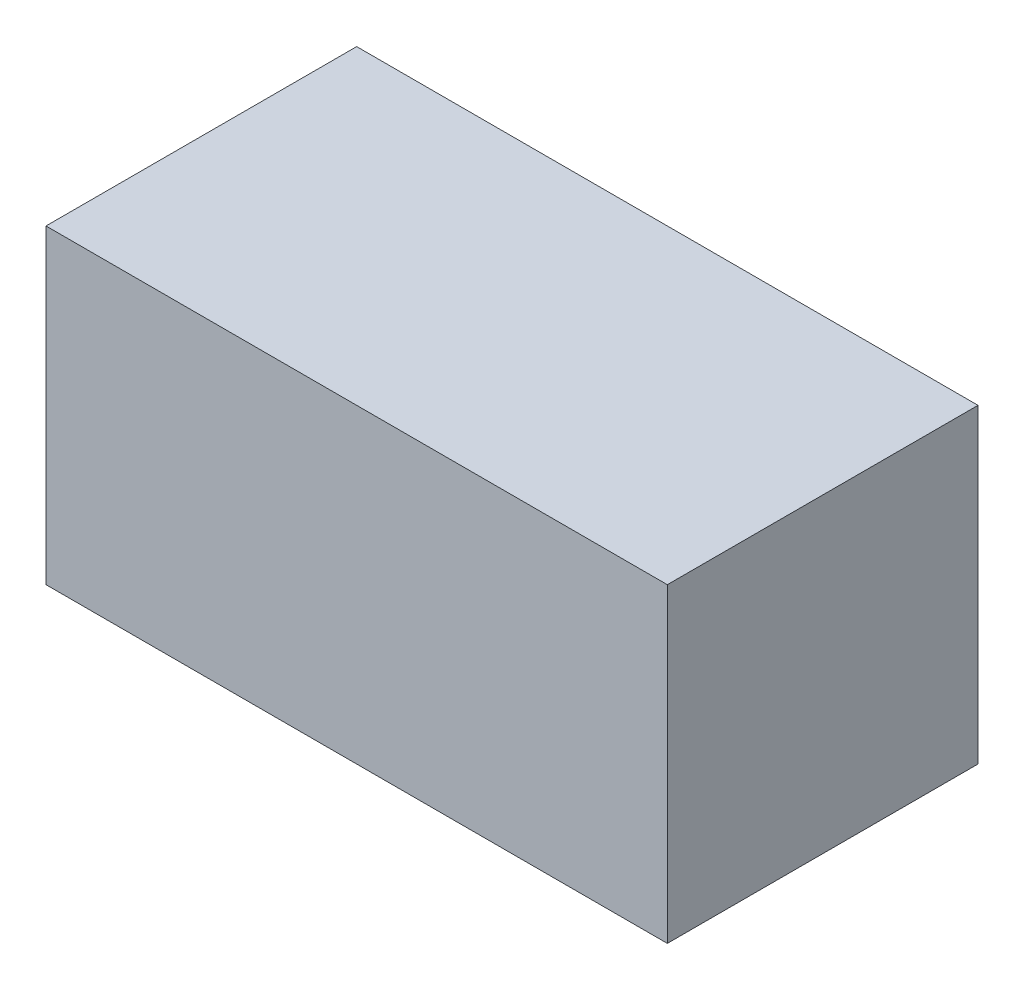
ISO-10303-21;
HEADER;
FILE_DESCRIPTION(('STEP AP214'),'2;1');
FILE_NAME('part.step','',(''),(''),'','','');
FILE_SCHEMA(('AUTOMOTIVE_DESIGN { 1 0 10303 214 1 1 1 1 }'));
ENDSEC;
DATA;
#1=APPLICATION_CONTEXT('core data for automotive mechanical design processes');
#2=APPLICATION_PROTOCOL_DEFINITION('international standard','automotive_design',2000,#1);
#3=PRODUCT_CONTEXT('',#1,'mechanical');
#4=PRODUCT('Part','Part','',(#3));
#5=PRODUCT_RELATED_PRODUCT_CATEGORY('part','',(#4));
#6=PRODUCT_DEFINITION_FORMATION('','',#4);
#7=PRODUCT_DEFINITION_CONTEXT('part definition',#1,'design');
#8=PRODUCT_DEFINITION('design','',#6,#7);
#9=PRODUCT_DEFINITION_SHAPE('','',#8);
#10=(LENGTH_UNIT() NAMED_UNIT(*) SI_UNIT(.MILLI.,.METRE.));
#11=(NAMED_UNIT(*) PLANE_ANGLE_UNIT() SI_UNIT($,.RADIAN.));
#12=(NAMED_UNIT(*) SI_UNIT($,.STERADIAN.) SOLID_ANGLE_UNIT());
#13=UNCERTAINTY_MEASURE_WITH_UNIT(LENGTH_MEASURE(1.E-05),#10,'distance_accuracy_value','');
#14=(GEOMETRIC_REPRESENTATION_CONTEXT(3) GLOBAL_UNCERTAINTY_ASSIGNED_CONTEXT((#13)) GLOBAL_UNIT_ASSIGNED_CONTEXT((#10,
#11,#12)) REPRESENTATION_CONTEXT('',''));
#15=CARTESIAN_POINT('',(0.,0.,0.));
#16=DIRECTION('',(0.,0.,1.));
#17=DIRECTION('',(1.,0.,0.));
#18=AXIS2_PLACEMENT_3D('',#15,#16,#17);
#19=CARTESIAN_POINT('',(0.,20.,10.));
#20=DIRECTION('',(1.,0.,0.));
#21=DIRECTION('',(0.,0.,-1.));
#22=AXIS2_PLACEMENT_3D('',#19,#20,#21);
#23=PLANE('',#22);
#24=DIRECTION('',(0.,-1.,0.));
#25=VECTOR('',#24,1.);
#26=CARTESIAN_POINT('',(0.,20.,-10.));
#27=LINE('',#26,#25);
#28=CARTESIAN_POINT('',(0.,20.,-10.));
#29=VERTEX_POINT('',#28);
#30=CARTESIAN_POINT('',(0.,0.,-10.));
#31=VERTEX_POINT('',#30);
#32=EDGE_CURVE('E105',#29,#31,#27,.T.);
#33=ORIENTED_EDGE('',*,*,#32,.T.);
#34=DIRECTION('',(0.,0.,-1.));
#35=VECTOR('',#34,1.);
#36=CARTESIAN_POINT('',(0.,0.,10.));
#37=LINE('',#36,#35);
#38=CARTESIAN_POINT('',(0.,0.,10.));
#39=VERTEX_POINT('',#38);
#40=EDGE_CURVE('E11',#39,#31,#37,.T.);
#41=ORIENTED_EDGE('',*,*,#40,.F.);
#42=DIRECTION('',(0.,-1.,0.));
#43=VECTOR('',#42,1.);
#44=CARTESIAN_POINT('',(0.,20.,10.));
#45=LINE('',#44,#43);
#46=CARTESIAN_POINT('',(0.,20.,10.));
#47=VERTEX_POINT('',#46);
#48=EDGE_CURVE('E93',#47,#39,#45,.T.);
#49=ORIENTED_EDGE('',*,*,#48,.F.);
#50=DIRECTION('',(0.,0.,-1.));
#51=VECTOR('',#50,1.);
#52=CARTESIAN_POINT('',(0.,20.,10.));
#53=LINE('',#52,#51);
#54=EDGE_CURVE('E101',#47,#29,#53,.T.);
#55=ORIENTED_EDGE('',*,*,#54,.T.);
#56=EDGE_LOOP('',(#33,#41,#49,#55));
#57=FACE_BOUND('',#56,.T.);
#58=ADVANCED_FACE('F42',(#57),#23,.F.);
#59=CARTESIAN_POINT('',(0.,0.,10.));
#60=DIRECTION('',(0.,1.,0.));
#61=DIRECTION('',(0.,0.,1.));
#62=AXIS2_PLACEMENT_3D('',#59,#60,#61);
#63=PLANE('',#62);
#64=DIRECTION('',(1.,0.,0.));
#65=VECTOR('',#64,1.);
#66=CARTESIAN_POINT('',(0.,0.,-10.));
#67=LINE('',#66,#65);
#68=CARTESIAN_POINT('',(40.,0.,-10.));
#69=VERTEX_POINT('',#68);
#70=EDGE_CURVE('E97',#31,#69,#67,.T.);
#71=ORIENTED_EDGE('',*,*,#70,.T.);
#72=DIRECTION('',(0.,0.,-1.));
#73=VECTOR('',#72,1.);
#74=CARTESIAN_POINT('',(40.,0.,10.));
#75=LINE('',#74,#73);
#76=CARTESIAN_POINT('',(40.,0.,10.));
#77=VERTEX_POINT('',#76);
#78=EDGE_CURVE('E50',#77,#69,#75,.T.);
#79=ORIENTED_EDGE('',*,*,#78,.F.);
#80=DIRECTION('',(1.,0.,0.));
#81=VECTOR('',#80,1.);
#82=CARTESIAN_POINT('',(0.,0.,10.));
#83=LINE('',#82,#81);
#84=EDGE_CURVE('E88',#39,#77,#83,.T.);
#85=ORIENTED_EDGE('',*,*,#84,.F.);
#86=ORIENTED_EDGE('',*,*,#40,.T.);
#87=EDGE_LOOP('',(#71,#79,#85,#86));
#88=FACE_BOUND('',#87,.T.);
#89=ADVANCED_FACE('F96',(#88),#63,.F.);
#90=CARTESIAN_POINT('',(40.,0.,10.));
#91=DIRECTION('',(-1.,0.,0.));
#92=DIRECTION('',(0.,0.,1.));
#93=AXIS2_PLACEMENT_3D('',#90,#91,#92);
#94=PLANE('',#93);
#95=DIRECTION('',(0.,1.,0.));
#96=VECTOR('',#95,1.);
#97=CARTESIAN_POINT('',(40.,0.,-10.));
#98=LINE('',#97,#96);
#99=CARTESIAN_POINT('',(40.,20.,-10.));
#100=VERTEX_POINT('',#99);
#101=EDGE_CURVE('E75',#69,#100,#98,.T.);
#102=ORIENTED_EDGE('',*,*,#101,.T.);
#103=DIRECTION('',(0.,0.,-1.));
#104=VECTOR('',#103,1.);
#105=CARTESIAN_POINT('',(40.,20.,10.));
#106=LINE('',#105,#104);
#107=CARTESIAN_POINT('',(40.,20.,10.));
#108=VERTEX_POINT('',#107);
#109=EDGE_CURVE('E98',#108,#100,#106,.T.);
#110=ORIENTED_EDGE('',*,*,#109,.F.);
#111=DIRECTION('',(0.,1.,0.));
#112=VECTOR('',#111,1.);
#113=CARTESIAN_POINT('',(40.,0.,10.));
#114=LINE('',#113,#112);
#115=EDGE_CURVE('E91',#77,#108,#114,.T.);
#116=ORIENTED_EDGE('',*,*,#115,.F.);
#117=ORIENTED_EDGE('',*,*,#78,.T.);
#118=EDGE_LOOP('',(#102,#110,#116,#117));
#119=FACE_BOUND('',#118,.T.);
#120=ADVANCED_FACE('F99',(#119),#94,.F.);
#121=CARTESIAN_POINT('',(40.,20.,10.));
#122=DIRECTION('',(0.,-1.,0.));
#123=DIRECTION('',(0.,0.,-1.));
#124=AXIS2_PLACEMENT_3D('',#121,#122,#123);
#125=PLANE('',#124);
#126=DIRECTION('',(-1.,0.,0.));
#127=VECTOR('',#126,1.);
#128=CARTESIAN_POINT('',(40.,20.,-10.));
#129=LINE('',#128,#127);
#130=EDGE_CURVE('E81',#100,#29,#129,.T.);
#131=ORIENTED_EDGE('',*,*,#130,.T.);
#132=ORIENTED_EDGE('',*,*,#54,.F.);
#133=DIRECTION('',(-1.,0.,0.));
#134=VECTOR('',#133,1.);
#135=CARTESIAN_POINT('',(40.,20.,10.));
#136=LINE('',#135,#134);
#137=EDGE_CURVE('E58',#108,#47,#136,.T.);
#138=ORIENTED_EDGE('',*,*,#137,.F.);
#139=ORIENTED_EDGE('',*,*,#109,.T.);
#140=EDGE_LOOP('',(#131,#132,#138,#139));
#141=FACE_BOUND('',#140,.T.);
#142=ADVANCED_FACE('F113',(#141),#125,.F.);
#143=CARTESIAN_POINT('',(0.,0.,10.));
#144=DIRECTION('',(0.,0.,1.));
#145=DIRECTION('',(1.,0.,0.));
#146=AXIS2_PLACEMENT_3D('',#143,#144,#145);
#147=PLANE('',#146);
#148=ORIENTED_EDGE('',*,*,#48,.T.);
#149=ORIENTED_EDGE('',*,*,#84,.T.);
#150=ORIENTED_EDGE('',*,*,#115,.T.);
#151=ORIENTED_EDGE('',*,*,#137,.T.);
#152=EDGE_LOOP('',(#148,#149,#150,#151));
#153=FACE_BOUND('',#152,.T.);
#154=ADVANCED_FACE('F89',(#153),#147,.T.);
#155=CARTESIAN_POINT('',(0.,0.,-10.));
#156=DIRECTION('',(0.,0.,1.));
#157=DIRECTION('',(1.,0.,0.));
#158=AXIS2_PLACEMENT_3D('',#155,#156,#157);
#159=PLANE('',#158);
#160=ORIENTED_EDGE('',*,*,#32,.F.);
#161=ORIENTED_EDGE('',*,*,#130,.F.);
#162=ORIENTED_EDGE('',*,*,#101,.F.);
#163=ORIENTED_EDGE('',*,*,#70,.F.);
#164=EDGE_LOOP('',(#160,#161,#162,#163));
#165=FACE_BOUND('',#164,.T.);
#166=ADVANCED_FACE('F116',(#165),#159,.F.);
#167=CLOSED_SHELL('',(#58,#89,#120,#142,#154,#166));
#168=CARTESIAN_POINT('',(20.,10.,-2.5));
#169=DIRECTION('',(0.,0.,1.));
#170=DIRECTION('',(1.,0.,0.));
#171=AXIS2_PLACEMENT_3D('',#168,#169,#170);
#172=CYLINDRICAL_SURFACE('',#171,4.);
#173=CARTESIAN_POINT('',(20.,10.,-2.5));
#174=DIRECTION('',(0.,0.,1.));
#175=DIRECTION('',(1.,0.,0.));
#176=AXIS2_PLACEMENT_3D('',#173,#174,#175);
#177=CIRCLE('',#176,4.);
#178=CARTESIAN_POINT('',(24.,10.,-2.5));
#179=VERTEX_POINT('',#178);
#180=EDGE_CURVE('E108',#179,#179,#177,.T.);
#181=ORIENTED_EDGE('',*,*,#180,.F.);
#182=EDGE_LOOP('',(#181));
#183=FACE_BOUND('',#182,.T.);
#184=CARTESIAN_POINT('',(20.,10.,2.5));
#185=DIRECTION('',(0.,0.,1.));
#186=DIRECTION('',(1.,0.,0.));
#187=AXIS2_PLACEMENT_3D('',#184,#185,#186);
#188=CIRCLE('',#187,4.);
#189=CARTESIAN_POINT('',(24.,10.,2.5));
#190=VERTEX_POINT('',#189);
#191=EDGE_CURVE('E119',#190,#190,#188,.T.);
#192=ORIENTED_EDGE('',*,*,#191,.T.);
#193=EDGE_LOOP('',(#192));
#194=FACE_BOUND('',#193,.T.);
#195=ADVANCED_FACE('F127',(#183,#194),#172,.F.);
#196=CARTESIAN_POINT('',(20.,10.,-2.5));
#197=DIRECTION('',(0.,0.,1.));
#198=DIRECTION('',(1.,0.,0.));
#199=AXIS2_PLACEMENT_3D('',#196,#197,#198);
#200=PLANE('',#199);
#201=ORIENTED_EDGE('',*,*,#180,.T.);
#202=EDGE_LOOP('',(#201));
#203=FACE_BOUND('',#202,.T.);
#204=ADVANCED_FACE('F125',(#203),#200,.T.);
#205=CARTESIAN_POINT('',(20.,10.,2.5));
#206=DIRECTION('',(0.,0.,1.));
#207=DIRECTION('',(1.,0.,0.));
#208=AXIS2_PLACEMENT_3D('',#205,#206,#207);
#209=PLANE('',#208);
#210=ORIENTED_EDGE('',*,*,#191,.F.);
#211=EDGE_LOOP('',(#210));
#212=FACE_BOUND('',#211,.T.);
#213=ADVANCED_FACE('F134',(#212),#209,.F.);
#214=CLOSED_SHELL('',(#195,#204,#213));
#215=ORIENTED_CLOSED_SHELL('',*,#214,.T.);
#216=BREP_WITH_VOIDS('B2',#167,(#215));
#217=ADVANCED_BREP_SHAPE_REPRESENTATION('',(#18,#216),#14);
#218=SHAPE_DEFINITION_REPRESENTATION(#9,#217);
ENDSEC;
END-ISO-10303-21;
